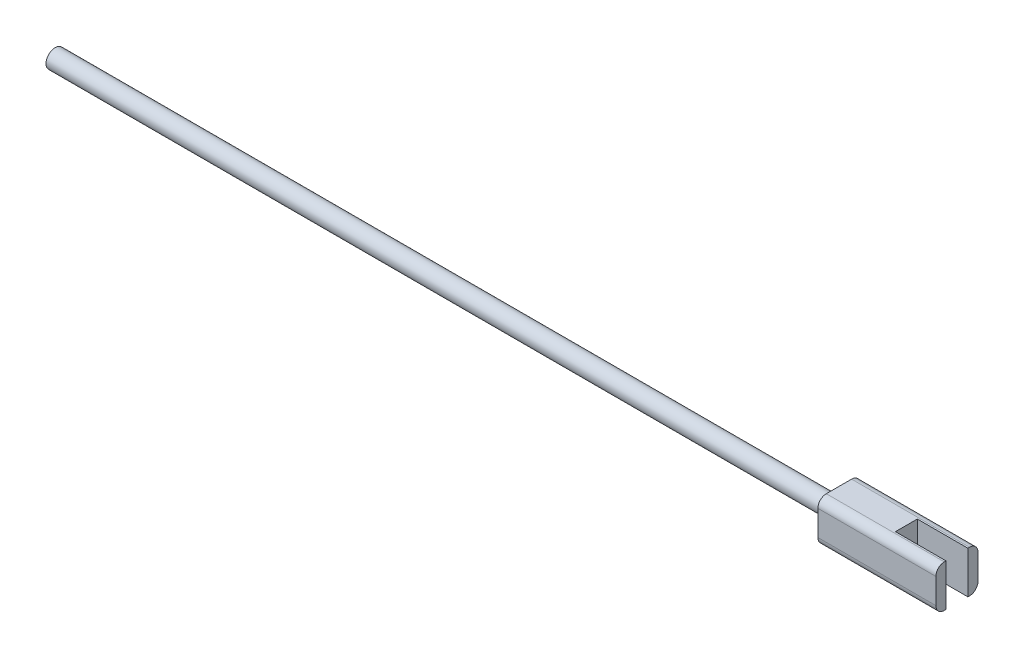
ISO-10303-21;
HEADER;
FILE_DESCRIPTION(('STEP AP214'),'2;1');
FILE_NAME('part.step','',(''),(''),'','','');
FILE_SCHEMA(('AUTOMOTIVE_DESIGN { 1 0 10303 214 1 1 1 1 }'));
ENDSEC;
DATA;
#1=APPLICATION_CONTEXT('core data for automotive mechanical design processes');
#2=APPLICATION_PROTOCOL_DEFINITION('international standard','automotive_design',2000,#1);
#3=PRODUCT_CONTEXT('',#1,'mechanical');
#4=PRODUCT('Part','Part','',(#3));
#5=PRODUCT_RELATED_PRODUCT_CATEGORY('part','',(#4));
#6=PRODUCT_DEFINITION_FORMATION('','',#4);
#7=PRODUCT_DEFINITION_CONTEXT('part definition',#1,'design');
#8=PRODUCT_DEFINITION('design','',#6,#7);
#9=PRODUCT_DEFINITION_SHAPE('','',#8);
#10=(LENGTH_UNIT() NAMED_UNIT(*) SI_UNIT(.MILLI.,.METRE.));
#11=(NAMED_UNIT(*) PLANE_ANGLE_UNIT() SI_UNIT($,.RADIAN.));
#12=(NAMED_UNIT(*) SI_UNIT($,.STERADIAN.) SOLID_ANGLE_UNIT());
#13=UNCERTAINTY_MEASURE_WITH_UNIT(LENGTH_MEASURE(1.E-05),#10,'distance_accuracy_value','');
#14=(GEOMETRIC_REPRESENTATION_CONTEXT(3) GLOBAL_UNCERTAINTY_ASSIGNED_CONTEXT((#13)) GLOBAL_UNIT_ASSIGNED_CONTEXT((#10,
#11,#12)) REPRESENTATION_CONTEXT('',''));
#15=CARTESIAN_POINT('',(0.,0.,0.));
#16=DIRECTION('',(0.,0.,1.));
#17=DIRECTION('',(1.,0.,0.));
#18=AXIS2_PLACEMENT_3D('',#15,#16,#17);
#19=CARTESIAN_POINT('',(107.007,-1.5,1.5));
#20=DIRECTION('',(1.,0.,0.));
#21=DIRECTION('',(0.,0.,-1.));
#22=AXIS2_PLACEMENT_3D('',#19,#20,#21);
#23=PLANE('',#22);
#24=DIRECTION('',(0.,1.,0.));
#25=VECTOR('',#24,1.);
#26=CARTESIAN_POINT('',(107.007,-1.5,-1.3));
#27=LINE('',#26,#25);
#28=CARTESIAN_POINT('',(107.007,-2.5,-1.3));
#29=VERTEX_POINT('',#28);
#30=CARTESIAN_POINT('',(107.007,2.5,-1.3));
#31=VERTEX_POINT('',#30);
#32=EDGE_CURVE('E11',#29,#31,#27,.T.);
#33=ORIENTED_EDGE('',*,*,#32,.F.);
#34=DIRECTION('',(0.,0.,-1.));
#35=VECTOR('',#34,1.);
#36=CARTESIAN_POINT('',(107.007,-2.5,1.5));
#37=LINE('',#36,#35);
#38=CARTESIAN_POINT('',(107.007,-2.5,-1.5));
#39=VERTEX_POINT('',#38);
#40=EDGE_CURVE('E202',#29,#39,#37,.T.);
#41=ORIENTED_EDGE('',*,*,#40,.T.);
#42=CARTESIAN_POINT('',(107.007,-1.5,-1.5));
#43=DIRECTION('',(1.,0.,0.));
#44=DIRECTION('',(0.,0.,-1.));
#45=AXIS2_PLACEMENT_3D('',#42,#43,#44);
#46=CIRCLE('',#45,1.);
#47=CARTESIAN_POINT('',(107.007,-1.5,-2.5));
#48=VERTEX_POINT('',#47);
#49=EDGE_CURVE('E201',#39,#48,#46,.T.);
#50=ORIENTED_EDGE('',*,*,#49,.T.);
#51=DIRECTION('',(0.,1.,0.));
#52=VECTOR('',#51,1.);
#53=CARTESIAN_POINT('',(107.007,-1.5,-2.5));
#54=LINE('',#53,#52);
#55=CARTESIAN_POINT('',(107.007,1.5,-2.5));
#56=VERTEX_POINT('',#55);
#57=EDGE_CURVE('E204',#48,#56,#54,.T.);
#58=ORIENTED_EDGE('',*,*,#57,.T.);
#59=CARTESIAN_POINT('',(107.007,1.5,-1.5));
#60=DIRECTION('',(1.,0.,0.));
#61=DIRECTION('',(0.,0.,-1.));
#62=AXIS2_PLACEMENT_3D('',#59,#60,#61);
#63=CIRCLE('',#62,1.);
#64=CARTESIAN_POINT('',(107.007,2.5,-1.5));
#65=VERTEX_POINT('',#64);
#66=EDGE_CURVE('E129',#56,#65,#63,.T.);
#67=ORIENTED_EDGE('',*,*,#66,.T.);
#68=DIRECTION('',(0.,0.,1.));
#69=VECTOR('',#68,1.);
#70=CARTESIAN_POINT('',(107.007,2.5,-1.5));
#71=LINE('',#70,#69);
#72=EDGE_CURVE('E128',#65,#31,#71,.T.);
#73=ORIENTED_EDGE('',*,*,#72,.T.);
#74=EDGE_LOOP('',(#33,#41,#50,#58,#67,#73));
#75=FACE_BOUND('',#74,.T.);
#76=ADVANCED_FACE('F39',(#75),#23,.T.);
#77=CARTESIAN_POINT('',(95.007,0.,0.));
#78=DIRECTION('',(-1.,0.,0.));
#79=DIRECTION('',(0.,0.,1.));
#80=AXIS2_PLACEMENT_3D('',#77,#78,#79);
#81=CYLINDRICAL_SURFACE('',#80,1.09);
#82=CARTESIAN_POINT('',(0.,0.,0.));
#83=DIRECTION('',(1.,0.,0.));
#84=DIRECTION('',(0.,0.,-1.));
#85=AXIS2_PLACEMENT_3D('',#82,#83,#84);
#86=CIRCLE('',#85,1.09);
#87=CARTESIAN_POINT('',(0.,0.,-1.09));
#88=VERTEX_POINT('',#87);
#89=EDGE_CURVE('E181',#88,#88,#86,.T.);
#90=ORIENTED_EDGE('',*,*,#89,.T.);
#91=EDGE_LOOP('',(#90));
#92=FACE_BOUND('',#91,.T.);
#93=CARTESIAN_POINT('',(93.007,0.,0.));
#94=DIRECTION('',(1.,0.,0.));
#95=DIRECTION('',(0.,0.,-1.));
#96=AXIS2_PLACEMENT_3D('',#93,#94,#95);
#97=CIRCLE('',#96,1.09);
#98=CARTESIAN_POINT('',(93.007,0.,-1.09));
#99=VERTEX_POINT('',#98);
#100=EDGE_CURVE('E184',#99,#99,#97,.T.);
#101=ORIENTED_EDGE('',*,*,#100,.F.);
#102=EDGE_LOOP('',(#101));
#103=FACE_BOUND('',#102,.T.);
#104=ADVANCED_FACE('F41',(#92,#103),#81,.T.);
#105=CARTESIAN_POINT('',(0.,0.,0.));
#106=DIRECTION('',(1.,0.,0.));
#107=DIRECTION('',(0.,0.,-1.));
#108=AXIS2_PLACEMENT_3D('',#105,#106,#107);
#109=PLANE('',#108);
#110=ORIENTED_EDGE('',*,*,#89,.F.);
#111=EDGE_LOOP('',(#110));
#112=FACE_BOUND('',#111,.T.);
#113=ADVANCED_FACE('F264',(#112),#109,.F.);
#114=CARTESIAN_POINT('',(107.007,-1.5,1.5));
#115=DIRECTION('',(-1.,0.,0.));
#116=DIRECTION('',(0.,0.,1.));
#117=AXIS2_PLACEMENT_3D('',#114,#115,#116);
#118=CYLINDRICAL_SURFACE('',#117,1.);
#119=CARTESIAN_POINT('',(93.007,-1.5,1.5));
#120=DIRECTION('',(1.,0.,0.));
#121=DIRECTION('',(0.,0.,-1.));
#122=AXIS2_PLACEMENT_3D('',#119,#120,#121);
#123=CIRCLE('',#122,1.);
#124=CARTESIAN_POINT('',(93.007,-1.5,2.5));
#125=VERTEX_POINT('',#124);
#126=CARTESIAN_POINT('',(93.007,-2.5,1.5));
#127=VERTEX_POINT('',#126);
#128=EDGE_CURVE('E150',#125,#127,#123,.T.);
#129=ORIENTED_EDGE('',*,*,#128,.T.);
#130=DIRECTION('',(-1.,0.,0.));
#131=VECTOR('',#130,1.);
#132=CARTESIAN_POINT('',(107.007,-2.5,1.5));
#133=LINE('',#132,#131);
#134=CARTESIAN_POINT('',(107.007,-2.5,1.5));
#135=VERTEX_POINT('',#134);
#136=EDGE_CURVE('E179',#135,#127,#133,.T.);
#137=ORIENTED_EDGE('',*,*,#136,.F.);
#138=CARTESIAN_POINT('',(107.007,-1.5,1.5));
#139=DIRECTION('',(1.,0.,0.));
#140=DIRECTION('',(0.,0.,-1.));
#141=AXIS2_PLACEMENT_3D('',#138,#139,#140);
#142=CIRCLE('',#141,1.);
#143=CARTESIAN_POINT('',(107.007,-1.5,2.5));
#144=VERTEX_POINT('',#143);
#145=EDGE_CURVE('E166',#144,#135,#142,.T.);
#146=ORIENTED_EDGE('',*,*,#145,.F.);
#147=DIRECTION('',(-1.,0.,0.));
#148=VECTOR('',#147,1.);
#149=CARTESIAN_POINT('',(107.007,-1.5,2.5));
#150=LINE('',#149,#148);
#151=EDGE_CURVE('E145',#144,#125,#150,.T.);
#152=ORIENTED_EDGE('',*,*,#151,.T.);
#153=EDGE_LOOP('',(#129,#137,#146,#152));
#154=FACE_BOUND('',#153,.T.);
#155=ADVANCED_FACE('F262',(#154),#118,.T.);
#156=CARTESIAN_POINT('',(107.007,-2.5,1.5));
#157=DIRECTION('',(0.,1.,0.));
#158=DIRECTION('',(0.,0.,1.));
#159=AXIS2_PLACEMENT_3D('',#156,#157,#158);
#160=PLANE('',#159);
#161=ORIENTED_EDGE('',*,*,#40,.F.);
#162=DIRECTION('',(-1.,0.,0.));
#163=VECTOR('',#162,1.);
#164=CARTESIAN_POINT('',(101.007,-2.5,-1.3));
#165=LINE('',#164,#163);
#166=CARTESIAN_POINT('',(101.007,-2.5,-1.3));
#167=VERTEX_POINT('',#166);
#168=EDGE_CURVE('E197',#29,#167,#165,.T.);
#169=ORIENTED_EDGE('',*,*,#168,.T.);
#170=DIRECTION('',(0.,0.,1.));
#171=VECTOR('',#170,1.);
#172=CARTESIAN_POINT('',(101.007,-2.5,1.3));
#173=LINE('',#172,#171);
#174=CARTESIAN_POINT('',(101.007,-2.5,1.3));
#175=VERTEX_POINT('',#174);
#176=EDGE_CURVE('E196',#167,#175,#173,.T.);
#177=ORIENTED_EDGE('',*,*,#176,.T.);
#178=DIRECTION('',(1.,0.,0.));
#179=VECTOR('',#178,1.);
#180=CARTESIAN_POINT('',(108.007,-2.5,1.3));
#181=LINE('',#180,#179);
#182=CARTESIAN_POINT('',(107.007,-2.5,1.3));
#183=VERTEX_POINT('',#182);
#184=EDGE_CURVE('E189',#175,#183,#181,.T.);
#185=ORIENTED_EDGE('',*,*,#184,.T.);
#186=EDGE_CURVE('E105',#135,#183,#37,.T.);
#187=ORIENTED_EDGE('',*,*,#186,.F.);
#188=ORIENTED_EDGE('',*,*,#136,.T.);
#189=DIRECTION('',(0.,0.,-1.));
#190=VECTOR('',#189,1.);
#191=CARTESIAN_POINT('',(93.007,-2.5,1.5));
#192=LINE('',#191,#190);
#193=CARTESIAN_POINT('',(93.007,-2.5,-1.5));
#194=VERTEX_POINT('',#193);
#195=EDGE_CURVE('E153',#127,#194,#192,.T.);
#196=ORIENTED_EDGE('',*,*,#195,.T.);
#197=DIRECTION('',(-1.,0.,0.));
#198=VECTOR('',#197,1.);
#199=CARTESIAN_POINT('',(107.007,-2.5,-1.5));
#200=LINE('',#199,#198);
#201=EDGE_CURVE('E176',#39,#194,#200,.T.);
#202=ORIENTED_EDGE('',*,*,#201,.F.);
#203=EDGE_LOOP('',(#161,#169,#177,#185,#187,#188,#196,#202));
#204=FACE_BOUND('',#203,.T.);
#205=ADVANCED_FACE('F193',(#204),#160,.F.);
#206=CARTESIAN_POINT('',(107.007,-1.5,-1.5));
#207=DIRECTION('',(-1.,0.,0.));
#208=DIRECTION('',(0.,0.,1.));
#209=AXIS2_PLACEMENT_3D('',#206,#207,#208);
#210=CYLINDRICAL_SURFACE('',#209,1.);
#211=CARTESIAN_POINT('',(93.007,-1.5,-1.5));
#212=DIRECTION('',(1.,0.,0.));
#213=DIRECTION('',(0.,0.,-1.));
#214=AXIS2_PLACEMENT_3D('',#211,#212,#213);
#215=CIRCLE('',#214,1.);
#216=CARTESIAN_POINT('',(93.007,-1.5,-2.5));
#217=VERTEX_POINT('',#216);
#218=EDGE_CURVE('E156',#194,#217,#215,.T.);
#219=ORIENTED_EDGE('',*,*,#218,.T.);
#220=DIRECTION('',(-1.,0.,0.));
#221=VECTOR('',#220,1.);
#222=CARTESIAN_POINT('',(107.007,-1.5,-2.5));
#223=LINE('',#222,#221);
#224=EDGE_CURVE('E173',#48,#217,#223,.T.);
#225=ORIENTED_EDGE('',*,*,#224,.F.);
#226=ORIENTED_EDGE('',*,*,#49,.F.);
#227=ORIENTED_EDGE('',*,*,#201,.T.);
#228=EDGE_LOOP('',(#219,#225,#226,#227));
#229=FACE_BOUND('',#228,.T.);
#230=ADVANCED_FACE('F253',(#229),#210,.T.);
#231=CARTESIAN_POINT('',(107.007,-1.5,-2.5));
#232=DIRECTION('',(0.,0.,1.));
#233=DIRECTION('',(1.,0.,0.));
#234=AXIS2_PLACEMENT_3D('',#231,#232,#233);
#235=PLANE('',#234);
#236=DIRECTION('',(0.,1.,0.));
#237=VECTOR('',#236,1.);
#238=CARTESIAN_POINT('',(93.007,-1.5,-2.5));
#239=LINE('',#238,#237);
#240=CARTESIAN_POINT('',(93.007,1.5,-2.5));
#241=VERTEX_POINT('',#240);
#242=EDGE_CURVE('E158',#217,#241,#239,.T.);
#243=ORIENTED_EDGE('',*,*,#242,.T.);
#244=DIRECTION('',(-1.,0.,0.));
#245=VECTOR('',#244,1.);
#246=CARTESIAN_POINT('',(107.007,1.5,-2.5));
#247=LINE('',#246,#245);
#248=EDGE_CURVE('E170',#56,#241,#247,.T.);
#249=ORIENTED_EDGE('',*,*,#248,.F.);
#250=ORIENTED_EDGE('',*,*,#57,.F.);
#251=ORIENTED_EDGE('',*,*,#224,.T.);
#252=EDGE_LOOP('',(#243,#249,#250,#251));
#253=FACE_BOUND('',#252,.T.);
#254=ADVANCED_FACE('F256',(#253),#235,.F.);
#255=CARTESIAN_POINT('',(107.007,1.5,-1.5));
#256=DIRECTION('',(-1.,0.,0.));
#257=DIRECTION('',(0.,0.,1.));
#258=AXIS2_PLACEMENT_3D('',#255,#256,#257);
#259=CYLINDRICAL_SURFACE('',#258,1.);
#260=CARTESIAN_POINT('',(93.007,1.5,-1.5));
#261=DIRECTION('',(1.,0.,0.));
#262=DIRECTION('',(0.,0.,-1.));
#263=AXIS2_PLACEMENT_3D('',#260,#261,#262);
#264=CIRCLE('',#263,1.);
#265=CARTESIAN_POINT('',(93.007,2.5,-1.5));
#266=VERTEX_POINT('',#265);
#267=EDGE_CURVE('E160',#241,#266,#264,.T.);
#268=ORIENTED_EDGE('',*,*,#267,.T.);
#269=DIRECTION('',(-1.,0.,0.));
#270=VECTOR('',#269,1.);
#271=CARTESIAN_POINT('',(107.007,2.5,-1.5));
#272=LINE('',#271,#270);
#273=EDGE_CURVE('E140',#65,#266,#272,.T.);
#274=ORIENTED_EDGE('',*,*,#273,.F.);
#275=ORIENTED_EDGE('',*,*,#66,.F.);
#276=ORIENTED_EDGE('',*,*,#248,.T.);
#277=EDGE_LOOP('',(#268,#274,#275,#276));
#278=FACE_BOUND('',#277,.T.);
#279=ADVANCED_FACE('F218',(#278),#259,.T.);
#280=CARTESIAN_POINT('',(107.007,2.5,-1.5));
#281=DIRECTION('',(0.,-1.,0.));
#282=DIRECTION('',(0.,0.,-1.));
#283=AXIS2_PLACEMENT_3D('',#280,#281,#282);
#284=PLANE('',#283);
#285=DIRECTION('',(0.,0.,1.));
#286=VECTOR('',#285,1.);
#287=CARTESIAN_POINT('',(101.007,2.5,1.3));
#288=LINE('',#287,#286);
#289=CARTESIAN_POINT('',(101.007,2.5,-1.3));
#290=VERTEX_POINT('',#289);
#291=CARTESIAN_POINT('',(101.007,2.5,1.3));
#292=VERTEX_POINT('',#291);
#293=EDGE_CURVE('E225',#290,#292,#288,.T.);
#294=ORIENTED_EDGE('',*,*,#293,.F.);
#295=DIRECTION('',(-1.,0.,0.));
#296=VECTOR('',#295,1.);
#297=CARTESIAN_POINT('',(101.007,2.5,-1.3));
#298=LINE('',#297,#296);
#299=EDGE_CURVE('E222',#31,#290,#298,.T.);
#300=ORIENTED_EDGE('',*,*,#299,.F.);
#301=ORIENTED_EDGE('',*,*,#72,.F.);
#302=ORIENTED_EDGE('',*,*,#273,.T.);
#303=DIRECTION('',(0.,0.,1.));
#304=VECTOR('',#303,1.);
#305=CARTESIAN_POINT('',(93.007,2.5,-1.5));
#306=LINE('',#305,#304);
#307=CARTESIAN_POINT('',(93.007,2.5,1.5));
#308=VERTEX_POINT('',#307);
#309=EDGE_CURVE('E137',#266,#308,#306,.T.);
#310=ORIENTED_EDGE('',*,*,#309,.T.);
#311=DIRECTION('',(-1.,0.,0.));
#312=VECTOR('',#311,1.);
#313=CARTESIAN_POINT('',(107.007,2.5,1.5));
#314=LINE('',#313,#312);
#315=CARTESIAN_POINT('',(107.007,2.5,1.5));
#316=VERTEX_POINT('',#315);
#317=EDGE_CURVE('E132',#316,#308,#314,.T.);
#318=ORIENTED_EDGE('',*,*,#317,.F.);
#319=CARTESIAN_POINT('',(107.007,2.5,1.3));
#320=VERTEX_POINT('',#319);
#321=EDGE_CURVE('E121',#320,#316,#71,.T.);
#322=ORIENTED_EDGE('',*,*,#321,.F.);
#323=DIRECTION('',(1.,0.,0.));
#324=VECTOR('',#323,1.);
#325=CARTESIAN_POINT('',(108.007,2.5,1.3));
#326=LINE('',#325,#324);
#327=EDGE_CURVE('E54',#292,#320,#326,.T.);
#328=ORIENTED_EDGE('',*,*,#327,.F.);
#329=EDGE_LOOP('',(#294,#300,#301,#302,#310,#318,#322,#328));
#330=FACE_BOUND('',#329,.T.);
#331=ADVANCED_FACE('F134',(#330),#284,.F.);
#332=CARTESIAN_POINT('',(107.007,1.5,1.5));
#333=DIRECTION('',(-1.,0.,0.));
#334=DIRECTION('',(0.,0.,1.));
#335=AXIS2_PLACEMENT_3D('',#332,#333,#334);
#336=CYLINDRICAL_SURFACE('',#335,1.);
#337=CARTESIAN_POINT('',(93.007,1.5,1.5));
#338=DIRECTION('',(1.,0.,0.));
#339=DIRECTION('',(0.,0.,-1.));
#340=AXIS2_PLACEMENT_3D('',#337,#338,#339);
#341=CIRCLE('',#340,1.);
#342=CARTESIAN_POINT('',(93.007,1.5,2.5));
#343=VERTEX_POINT('',#342);
#344=EDGE_CURVE('E163',#308,#343,#341,.T.);
#345=ORIENTED_EDGE('',*,*,#344,.T.);
#346=DIRECTION('',(-1.,0.,0.));
#347=VECTOR('',#346,1.);
#348=CARTESIAN_POINT('',(107.007,1.5,2.5));
#349=LINE('',#348,#347);
#350=CARTESIAN_POINT('',(107.007,1.5,2.5));
#351=VERTEX_POINT('',#350);
#352=EDGE_CURVE('E141',#351,#343,#349,.T.);
#353=ORIENTED_EDGE('',*,*,#352,.F.);
#354=CARTESIAN_POINT('',(107.007,1.5,1.5));
#355=DIRECTION('',(1.,0.,0.));
#356=DIRECTION('',(0.,0.,-1.));
#357=AXIS2_PLACEMENT_3D('',#354,#355,#356);
#358=CIRCLE('',#357,1.);
#359=EDGE_CURVE('E125',#316,#351,#358,.T.);
#360=ORIENTED_EDGE('',*,*,#359,.F.);
#361=ORIENTED_EDGE('',*,*,#317,.T.);
#362=EDGE_LOOP('',(#345,#353,#360,#361));
#363=FACE_BOUND('',#362,.T.);
#364=ADVANCED_FACE('F143',(#363),#336,.T.);
#365=CARTESIAN_POINT('',(107.007,1.5,2.5));
#366=DIRECTION('',(0.,0.,-1.));
#367=DIRECTION('',(-1.,0.,0.));
#368=AXIS2_PLACEMENT_3D('',#365,#366,#367);
#369=PLANE('',#368);
#370=DIRECTION('',(0.,-1.,0.));
#371=VECTOR('',#370,1.);
#372=CARTESIAN_POINT('',(93.007,1.5,2.5));
#373=LINE('',#372,#371);
#374=EDGE_CURVE('E96',#343,#125,#373,.T.);
#375=ORIENTED_EDGE('',*,*,#374,.T.);
#376=ORIENTED_EDGE('',*,*,#151,.F.);
#377=DIRECTION('',(0.,-1.,0.));
#378=VECTOR('',#377,1.);
#379=CARTESIAN_POINT('',(107.007,1.5,2.5));
#380=LINE('',#379,#378);
#381=EDGE_CURVE('E63',#351,#144,#380,.T.);
#382=ORIENTED_EDGE('',*,*,#381,.F.);
#383=ORIENTED_EDGE('',*,*,#352,.T.);
#384=EDGE_LOOP('',(#375,#376,#382,#383));
#385=FACE_BOUND('',#384,.T.);
#386=ADVANCED_FACE('F260',(#385),#369,.F.);
#387=DIRECTION('',(0.,-1.,0.));
#388=VECTOR('',#387,1.);
#389=CARTESIAN_POINT('',(107.007,-1.5,1.3));
#390=LINE('',#389,#388);
#391=EDGE_CURVE('E47',#320,#183,#390,.T.);
#392=ORIENTED_EDGE('',*,*,#391,.F.);
#393=ORIENTED_EDGE('',*,*,#321,.T.);
#394=ORIENTED_EDGE('',*,*,#359,.T.);
#395=ORIENTED_EDGE('',*,*,#381,.T.);
#396=ORIENTED_EDGE('',*,*,#145,.T.);
#397=ORIENTED_EDGE('',*,*,#186,.T.);
#398=EDGE_LOOP('',(#392,#393,#394,#395,#396,#397));
#399=FACE_BOUND('',#398,.T.);
#400=ADVANCED_FACE('F123',(#399),#23,.T.);
#401=CARTESIAN_POINT('',(93.007,-1.5,1.5));
#402=DIRECTION('',(1.,0.,0.));
#403=DIRECTION('',(0.,0.,-1.));
#404=AXIS2_PLACEMENT_3D('',#401,#402,#403);
#405=PLANE('',#404);
#406=ORIENTED_EDGE('',*,*,#100,.T.);
#407=EDGE_LOOP('',(#406));
#408=FACE_BOUND('',#407,.T.);
#409=ORIENTED_EDGE('',*,*,#128,.F.);
#410=ORIENTED_EDGE('',*,*,#374,.F.);
#411=ORIENTED_EDGE('',*,*,#344,.F.);
#412=ORIENTED_EDGE('',*,*,#309,.F.);
#413=ORIENTED_EDGE('',*,*,#267,.F.);
#414=ORIENTED_EDGE('',*,*,#242,.F.);
#415=ORIENTED_EDGE('',*,*,#218,.F.);
#416=ORIENTED_EDGE('',*,*,#195,.F.);
#417=EDGE_LOOP('',(#409,#410,#411,#412,#413,#414,#415,#416));
#418=FACE_BOUND('',#417,.T.);
#419=ADVANCED_FACE('F259',(#408,#418),#405,.F.);
#420=CARTESIAN_POINT('',(101.007,-2.5,1.3));
#421=DIRECTION('',(-1.,0.,0.));
#422=DIRECTION('',(0.,0.,1.));
#423=AXIS2_PLACEMENT_3D('',#420,#421,#422);
#424=PLANE('',#423);
#425=DIRECTION('',(0.,1.,0.));
#426=VECTOR('',#425,1.);
#427=CARTESIAN_POINT('',(101.007,-2.5,1.3));
#428=LINE('',#427,#426);
#429=EDGE_CURVE('E237',#175,#292,#428,.T.);
#430=ORIENTED_EDGE('',*,*,#429,.F.);
#431=ORIENTED_EDGE('',*,*,#176,.F.);
#432=DIRECTION('',(0.,1.,0.));
#433=VECTOR('',#432,1.);
#434=CARTESIAN_POINT('',(101.007,-2.5,-1.3));
#435=LINE('',#434,#433);
#436=EDGE_CURVE('E154',#167,#290,#435,.T.);
#437=ORIENTED_EDGE('',*,*,#436,.T.);
#438=ORIENTED_EDGE('',*,*,#293,.T.);
#439=EDGE_LOOP('',(#430,#431,#437,#438));
#440=FACE_BOUND('',#439,.T.);
#441=ADVANCED_FACE('F242',(#440),#424,.F.);
#442=CARTESIAN_POINT('',(101.007,-2.5,-1.3));
#443=DIRECTION('',(0.,0.,-1.));
#444=DIRECTION('',(-1.,0.,0.));
#445=AXIS2_PLACEMENT_3D('',#442,#443,#444);
#446=PLANE('',#445);
#447=ORIENTED_EDGE('',*,*,#32,.T.);
#448=ORIENTED_EDGE('',*,*,#299,.T.);
#449=ORIENTED_EDGE('',*,*,#436,.F.);
#450=ORIENTED_EDGE('',*,*,#168,.F.);
#451=EDGE_LOOP('',(#447,#448,#449,#450));
#452=FACE_BOUND('',#451,.T.);
#453=ADVANCED_FACE('F245',(#452),#446,.F.);
#454=CARTESIAN_POINT('',(108.007,-2.5,1.3));
#455=DIRECTION('',(0.,0.,1.));
#456=DIRECTION('',(1.,0.,0.));
#457=AXIS2_PLACEMENT_3D('',#454,#455,#456);
#458=PLANE('',#457);
#459=ORIENTED_EDGE('',*,*,#391,.T.);
#460=ORIENTED_EDGE('',*,*,#184,.F.);
#461=ORIENTED_EDGE('',*,*,#429,.T.);
#462=ORIENTED_EDGE('',*,*,#327,.T.);
#463=EDGE_LOOP('',(#459,#460,#461,#462));
#464=FACE_BOUND('',#463,.T.);
#465=ADVANCED_FACE('F187',(#464),#458,.F.);
#466=CLOSED_SHELL('',(#76,#104,#113,#155,#205,#230,#254,#279,#331,#364,#386,#400,#419,#441,#453,#465));
#467=MANIFOLD_SOLID_BREP('B2',#466);
#468=ADVANCED_BREP_SHAPE_REPRESENTATION('',(#18,#467),#14);
#469=SHAPE_DEFINITION_REPRESENTATION(#9,#468);
ENDSEC;
END-ISO-10303-21;
